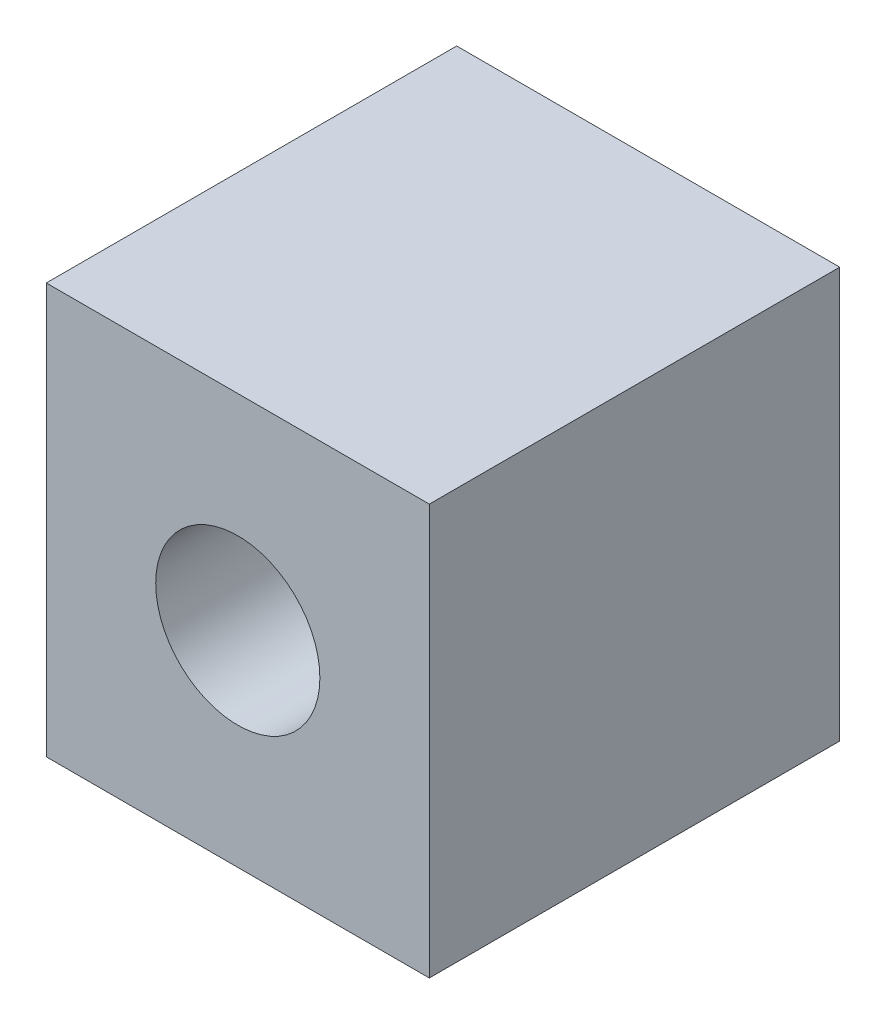
ISO-10303-21;
HEADER;
FILE_DESCRIPTION(('STEP AP214'),'2;1');
FILE_NAME('part.step','',(''),(''),'','','');
FILE_SCHEMA(('AUTOMOTIVE_DESIGN { 1 0 10303 214 1 1 1 1 }'));
ENDSEC;
DATA;
#1=APPLICATION_CONTEXT('core data for automotive mechanical design processes');
#2=APPLICATION_PROTOCOL_DEFINITION('international standard','automotive_design',2000,#1);
#3=PRODUCT_CONTEXT('',#1,'mechanical');
#4=PRODUCT('Part','Part','',(#3));
#5=PRODUCT_RELATED_PRODUCT_CATEGORY('part','',(#4));
#6=PRODUCT_DEFINITION_FORMATION('','',#4);
#7=PRODUCT_DEFINITION_CONTEXT('part definition',#1,'design');
#8=PRODUCT_DEFINITION('design','',#6,#7);
#9=PRODUCT_DEFINITION_SHAPE('','',#8);
#10=(LENGTH_UNIT() NAMED_UNIT(*) SI_UNIT(.MILLI.,.METRE.));
#11=(NAMED_UNIT(*) PLANE_ANGLE_UNIT() SI_UNIT($,.RADIAN.));
#12=(NAMED_UNIT(*) SI_UNIT($,.STERADIAN.) SOLID_ANGLE_UNIT());
#13=UNCERTAINTY_MEASURE_WITH_UNIT(LENGTH_MEASURE(1.E-05),#10,'distance_accuracy_value','');
#14=(GEOMETRIC_REPRESENTATION_CONTEXT(3) GLOBAL_UNCERTAINTY_ASSIGNED_CONTEXT((#13)) GLOBAL_UNIT_ASSIGNED_CONTEXT((#10,
#11,#12)) REPRESENTATION_CONTEXT('',''));
#15=CARTESIAN_POINT('',(0.,0.,0.));
#16=DIRECTION('',(0.,0.,1.));
#17=DIRECTION('',(1.,0.,0.));
#18=AXIS2_PLACEMENT_3D('',#15,#16,#17);
#19=CARTESIAN_POINT('',(-14.,30.,0.));
#20=DIRECTION('',(1.,0.,0.));
#21=DIRECTION('',(0.,0.,-1.));
#22=AXIS2_PLACEMENT_3D('',#19,#20,#21);
#23=PLANE('',#22);
#24=DIRECTION('',(0.,0.,1.));
#25=VECTOR('',#24,1.);
#26=CARTESIAN_POINT('',(-14.,0.,0.));
#27=LINE('',#26,#25);
#28=CARTESIAN_POINT('',(-14.,0.,-15.));
#29=VERTEX_POINT('',#28);
#30=CARTESIAN_POINT('',(-14.,0.,15.));
#31=VERTEX_POINT('',#30);
#32=EDGE_CURVE('E72',#29,#31,#27,.T.);
#33=ORIENTED_EDGE('',*,*,#32,.T.);
#34=DIRECTION('',(0.,-1.,0.));
#35=VECTOR('',#34,1.);
#36=CARTESIAN_POINT('',(-14.,30.,15.));
#37=LINE('',#36,#35);
#38=CARTESIAN_POINT('',(-14.,30.,15.));
#39=VERTEX_POINT('',#38);
#40=EDGE_CURVE('E11',#39,#31,#37,.T.);
#41=ORIENTED_EDGE('',*,*,#40,.F.);
#42=DIRECTION('',(0.,0.,1.));
#43=VECTOR('',#42,1.);
#44=CARTESIAN_POINT('',(-14.,30.,-15.));
#45=LINE('',#44,#43);
#46=CARTESIAN_POINT('',(-14.,30.,-15.));
#47=VERTEX_POINT('',#46);
#48=EDGE_CURVE('E77',#47,#39,#45,.T.);
#49=ORIENTED_EDGE('',*,*,#48,.F.);
#50=DIRECTION('',(0.,-1.,0.));
#51=VECTOR('',#50,1.);
#52=CARTESIAN_POINT('',(-14.,30.,-15.));
#53=LINE('',#52,#51);
#54=EDGE_CURVE('E92',#47,#29,#53,.T.);
#55=ORIENTED_EDGE('',*,*,#54,.T.);
#56=EDGE_LOOP('',(#33,#41,#49,#55));
#57=FACE_BOUND('',#56,.T.);
#58=ADVANCED_FACE('F32',(#57),#23,.F.);
#59=CARTESIAN_POINT('',(-14.,30.,15.));
#60=DIRECTION('',(0.,0.,-1.));
#61=DIRECTION('',(-1.,0.,0.));
#62=AXIS2_PLACEMENT_3D('',#59,#60,#61);
#63=PLANE('',#62);
#64=CARTESIAN_POINT('',(0.,15.,15.));
#65=DIRECTION('',(0.,0.,1.));
#66=DIRECTION('',(1.,0.,0.));
#67=AXIS2_PLACEMENT_3D('',#64,#65,#66);
#68=CIRCLE('',#67,6.);
#69=CARTESIAN_POINT('',(6.,15.,15.));
#70=VERTEX_POINT('',#69);
#71=EDGE_CURVE('E125',#70,#70,#68,.T.);
#72=ORIENTED_EDGE('',*,*,#71,.F.);
#73=EDGE_LOOP('',(#72));
#74=FACE_BOUND('',#73,.T.);
#75=DIRECTION('',(1.,0.,0.));
#76=VECTOR('',#75,1.);
#77=CARTESIAN_POINT('',(-14.,0.,15.));
#78=LINE('',#77,#76);
#79=CARTESIAN_POINT('',(14.,0.,15.));
#80=VERTEX_POINT('',#79);
#81=EDGE_CURVE('E88',#31,#80,#78,.T.);
#82=ORIENTED_EDGE('',*,*,#81,.T.);
#83=DIRECTION('',(0.,-1.,0.));
#84=VECTOR('',#83,1.);
#85=CARTESIAN_POINT('',(14.,30.,15.));
#86=LINE('',#85,#84);
#87=CARTESIAN_POINT('',(14.,30.,15.));
#88=VERTEX_POINT('',#87);
#89=EDGE_CURVE('E40',#88,#80,#86,.T.);
#90=ORIENTED_EDGE('',*,*,#89,.F.);
#91=DIRECTION('',(1.,0.,0.));
#92=VECTOR('',#91,1.);
#93=CARTESIAN_POINT('',(-14.,30.,15.));
#94=LINE('',#93,#92);
#95=EDGE_CURVE('E80',#39,#88,#94,.T.);
#96=ORIENTED_EDGE('',*,*,#95,.F.);
#97=ORIENTED_EDGE('',*,*,#40,.T.);
#98=EDGE_LOOP('',(#82,#90,#96,#97));
#99=FACE_BOUND('',#98,.T.);
#100=ADVANCED_FACE('F87',(#74,#99),#63,.F.);
#101=CARTESIAN_POINT('',(14.,30.,15.));
#102=DIRECTION('',(-1.,0.,0.));
#103=DIRECTION('',(0.,0.,1.));
#104=AXIS2_PLACEMENT_3D('',#101,#102,#103);
#105=PLANE('',#104);
#106=DIRECTION('',(0.,0.,-1.));
#107=VECTOR('',#106,1.);
#108=CARTESIAN_POINT('',(14.,0.,15.));
#109=LINE('',#108,#107);
#110=CARTESIAN_POINT('',(14.,0.,-15.));
#111=VERTEX_POINT('',#110);
#112=EDGE_CURVE('E65',#80,#111,#109,.T.);
#113=ORIENTED_EDGE('',*,*,#112,.T.);
#114=DIRECTION('',(0.,-1.,0.));
#115=VECTOR('',#114,1.);
#116=CARTESIAN_POINT('',(14.,30.,-15.));
#117=LINE('',#116,#115);
#118=CARTESIAN_POINT('',(14.,30.,-15.));
#119=VERTEX_POINT('',#118);
#120=EDGE_CURVE('E89',#119,#111,#117,.T.);
#121=ORIENTED_EDGE('',*,*,#120,.F.);
#122=DIRECTION('',(0.,0.,-1.));
#123=VECTOR('',#122,1.);
#124=CARTESIAN_POINT('',(14.,30.,15.));
#125=LINE('',#124,#123);
#126=EDGE_CURVE('E84',#88,#119,#125,.T.);
#127=ORIENTED_EDGE('',*,*,#126,.F.);
#128=ORIENTED_EDGE('',*,*,#89,.T.);
#129=EDGE_LOOP('',(#113,#121,#127,#128));
#130=FACE_BOUND('',#129,.T.);
#131=ADVANCED_FACE('F90',(#130),#105,.F.);
#132=CARTESIAN_POINT('',(14.,30.,-15.));
#133=DIRECTION('',(0.,0.,1.));
#134=DIRECTION('',(1.,0.,0.));
#135=AXIS2_PLACEMENT_3D('',#132,#133,#134);
#136=PLANE('',#135);
#137=CARTESIAN_POINT('',(0.,15.,-15.));
#138=DIRECTION('',(0.,0.,1.));
#139=DIRECTION('',(1.,0.,0.));
#140=AXIS2_PLACEMENT_3D('',#137,#138,#139);
#141=CIRCLE('',#140,6.);
#142=CARTESIAN_POINT('',(6.,15.,-15.));
#143=VERTEX_POINT('',#142);
#144=EDGE_CURVE('E97',#143,#143,#141,.T.);
#145=ORIENTED_EDGE('',*,*,#144,.T.);
#146=EDGE_LOOP('',(#145));
#147=FACE_BOUND('',#146,.T.);
#148=DIRECTION('',(-1.,0.,0.));
#149=VECTOR('',#148,1.);
#150=CARTESIAN_POINT('',(14.,0.,-15.));
#151=LINE('',#150,#149);
#152=EDGE_CURVE('E100',#111,#29,#151,.T.);
#153=ORIENTED_EDGE('',*,*,#152,.T.);
#154=ORIENTED_EDGE('',*,*,#54,.F.);
#155=DIRECTION('',(-1.,0.,0.));
#156=VECTOR('',#155,1.);
#157=CARTESIAN_POINT('',(14.,30.,-15.));
#158=LINE('',#157,#156);
#159=EDGE_CURVE('E48',#119,#47,#158,.T.);
#160=ORIENTED_EDGE('',*,*,#159,.F.);
#161=ORIENTED_EDGE('',*,*,#120,.T.);
#162=EDGE_LOOP('',(#153,#154,#160,#161));
#163=FACE_BOUND('',#162,.T.);
#164=ADVANCED_FACE('F105',(#147,#163),#136,.F.);
#165=CARTESIAN_POINT('',(0.,30.,0.));
#166=DIRECTION('',(0.,1.,0.));
#167=DIRECTION('',(0.,0.,1.));
#168=AXIS2_PLACEMENT_3D('',#165,#166,#167);
#169=PLANE('',#168);
#170=ORIENTED_EDGE('',*,*,#48,.T.);
#171=ORIENTED_EDGE('',*,*,#95,.T.);
#172=ORIENTED_EDGE('',*,*,#126,.T.);
#173=ORIENTED_EDGE('',*,*,#159,.T.);
#174=EDGE_LOOP('',(#170,#171,#172,#173));
#175=FACE_BOUND('',#174,.T.);
#176=ADVANCED_FACE('F82',(#175),#169,.T.);
#177=CARTESIAN_POINT('',(0.,0.,0.));
#178=DIRECTION('',(0.,1.,0.));
#179=DIRECTION('',(0.,0.,1.));
#180=AXIS2_PLACEMENT_3D('',#177,#178,#179);
#181=PLANE('',#180);
#182=ORIENTED_EDGE('',*,*,#32,.F.);
#183=ORIENTED_EDGE('',*,*,#152,.F.);
#184=ORIENTED_EDGE('',*,*,#112,.F.);
#185=ORIENTED_EDGE('',*,*,#81,.F.);
#186=EDGE_LOOP('',(#182,#183,#184,#185));
#187=FACE_BOUND('',#186,.T.);
#188=ADVANCED_FACE('F106',(#187),#181,.F.);
#189=CARTESIAN_POINT('',(0.,15.,-15.));
#190=DIRECTION('',(0.,0.,1.));
#191=DIRECTION('',(1.,0.,0.));
#192=AXIS2_PLACEMENT_3D('',#189,#190,#191);
#193=CYLINDRICAL_SURFACE('',#192,6.);
#194=ORIENTED_EDGE('',*,*,#144,.F.);
#195=EDGE_LOOP('',(#194));
#196=FACE_BOUND('',#195,.T.);
#197=ORIENTED_EDGE('',*,*,#71,.T.);
#198=EDGE_LOOP('',(#197));
#199=FACE_BOUND('',#198,.T.);
#200=ADVANCED_FACE('F108',(#196,#199),#193,.F.);
#201=CLOSED_SHELL('',(#58,#100,#131,#164,#176,#188,#200));
#202=MANIFOLD_SOLID_BREP('B2',#201);
#203=ADVANCED_BREP_SHAPE_REPRESENTATION('',(#18,#202),#14);
#204=SHAPE_DEFINITION_REPRESENTATION(#9,#203);
ENDSEC;
END-ISO-10303-21;
